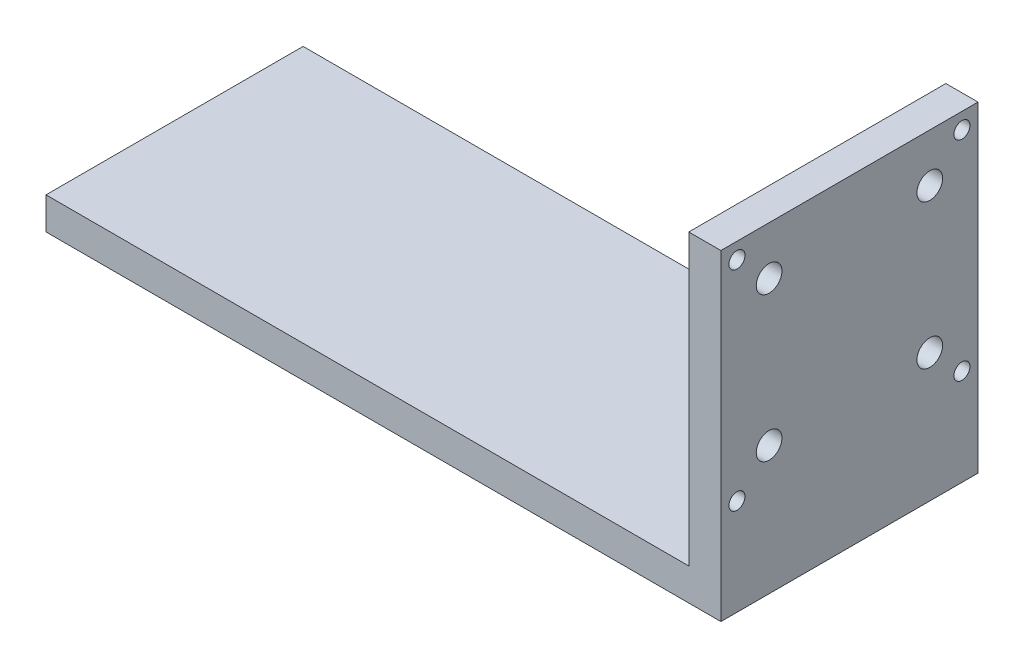
ISO-10303-21;
HEADER;
FILE_DESCRIPTION(('STEP AP214'),'2;1');
FILE_NAME('part.step','',(''),(''),'','','');
FILE_SCHEMA(('AUTOMOTIVE_DESIGN { 1 0 10303 214 1 1 1 1 }'));
ENDSEC;
DATA;
#1=APPLICATION_CONTEXT('core data for automotive mechanical design processes');
#2=APPLICATION_PROTOCOL_DEFINITION('international standard','automotive_design',2000,#1);
#3=PRODUCT_CONTEXT('',#1,'mechanical');
#4=PRODUCT('Part','Part','',(#3));
#5=PRODUCT_RELATED_PRODUCT_CATEGORY('part','',(#4));
#6=PRODUCT_DEFINITION_FORMATION('','',#4);
#7=PRODUCT_DEFINITION_CONTEXT('part definition',#1,'design');
#8=PRODUCT_DEFINITION('design','',#6,#7);
#9=PRODUCT_DEFINITION_SHAPE('','',#8);
#10=(LENGTH_UNIT() NAMED_UNIT(*) SI_UNIT(.MILLI.,.METRE.));
#11=(NAMED_UNIT(*) PLANE_ANGLE_UNIT() SI_UNIT($,.RADIAN.));
#12=(NAMED_UNIT(*) SI_UNIT($,.STERADIAN.) SOLID_ANGLE_UNIT());
#13=UNCERTAINTY_MEASURE_WITH_UNIT(LENGTH_MEASURE(1.E-05),#10,'distance_accuracy_value','');
#14=(GEOMETRIC_REPRESENTATION_CONTEXT(3) GLOBAL_UNCERTAINTY_ASSIGNED_CONTEXT((#13)) GLOBAL_UNIT_ASSIGNED_CONTEXT((#10,
#11,#12)) REPRESENTATION_CONTEXT('',''));
#15=CARTESIAN_POINT('',(0.,0.,0.));
#16=DIRECTION('',(0.,0.,1.));
#17=DIRECTION('',(1.,0.,0.));
#18=AXIS2_PLACEMENT_3D('',#15,#16,#17);
#19=CARTESIAN_POINT('',(-100.,10.,-40.));
#20=DIRECTION('',(0.,0.,1.));
#21=DIRECTION('',(1.,0.,0.));
#22=AXIS2_PLACEMENT_3D('',#19,#20,#21);
#23=PLANE('',#22);
#24=DIRECTION('',(-1.,0.,0.));
#25=VECTOR('',#24,1.);
#26=CARTESIAN_POINT('',(-100.,0.,-40.));
#27=LINE('',#26,#25);
#28=CARTESIAN_POINT('',(110.,0.,-40.));
#29=VERTEX_POINT('',#28);
#30=CARTESIAN_POINT('',(-100.,0.,-40.));
#31=VERTEX_POINT('',#30);
#32=EDGE_CURVE('E71',#29,#31,#27,.T.);
#33=ORIENTED_EDGE('',*,*,#32,.T.);
#34=DIRECTION('',(0.,-1.,0.));
#35=VECTOR('',#34,1.);
#36=CARTESIAN_POINT('',(-100.,10.,-40.));
#37=LINE('',#36,#35);
#38=CARTESIAN_POINT('',(-100.,10.,-40.));
#39=VERTEX_POINT('',#38);
#40=EDGE_CURVE('E11',#39,#31,#37,.T.);
#41=ORIENTED_EDGE('',*,*,#40,.F.);
#42=DIRECTION('',(-1.,0.,0.));
#43=VECTOR('',#42,1.);
#44=CARTESIAN_POINT('',(-100.,10.,-40.));
#45=LINE('',#44,#43);
#46=CARTESIAN_POINT('',(100.,10.,-40.));
#47=VERTEX_POINT('',#46);
#48=EDGE_CURVE('E100',#47,#39,#45,.T.);
#49=ORIENTED_EDGE('',*,*,#48,.F.);
#50=DIRECTION('',(0.,1.,0.));
#51=VECTOR('',#50,1.);
#52=CARTESIAN_POINT('',(100.,0.,-40.));
#53=LINE('',#52,#51);
#54=CARTESIAN_POINT('',(100.,100.,-40.));
#55=VERTEX_POINT('',#54);
#56=EDGE_CURVE('E90',#47,#55,#53,.T.);
#57=ORIENTED_EDGE('',*,*,#56,.T.);
#58=DIRECTION('',(-1.,0.,0.));
#59=VECTOR('',#58,1.);
#60=CARTESIAN_POINT('',(110.,100.,-40.));
#61=LINE('',#60,#59);
#62=CARTESIAN_POINT('',(110.,100.,-40.));
#63=VERTEX_POINT('',#62);
#64=EDGE_CURVE('E111',#63,#55,#61,.T.);
#65=ORIENTED_EDGE('',*,*,#64,.F.);
#66=DIRECTION('',(0.,1.,0.));
#67=VECTOR('',#66,1.);
#68=CARTESIAN_POINT('',(110.,0.,-40.));
#69=LINE('',#68,#67);
#70=EDGE_CURVE('E167',#29,#63,#69,.T.);
#71=ORIENTED_EDGE('',*,*,#70,.F.);
#72=EDGE_LOOP('',(#33,#41,#49,#57,#65,#71));
#73=FACE_BOUND('',#72,.T.);
#74=ADVANCED_FACE('F41',(#73),#23,.F.);
#75=CARTESIAN_POINT('',(-100.,10.,40.));
#76=DIRECTION('',(1.,0.,0.));
#77=DIRECTION('',(0.,0.,-1.));
#78=AXIS2_PLACEMENT_3D('',#75,#76,#77);
#79=PLANE('',#78);
#80=DIRECTION('',(0.,0.,1.));
#81=VECTOR('',#80,1.);
#82=CARTESIAN_POINT('',(-100.,0.,40.));
#83=LINE('',#82,#81);
#84=CARTESIAN_POINT('',(-100.,0.,40.));
#85=VERTEX_POINT('',#84);
#86=EDGE_CURVE('E108',#31,#85,#83,.T.);
#87=ORIENTED_EDGE('',*,*,#86,.T.);
#88=DIRECTION('',(0.,-1.,0.));
#89=VECTOR('',#88,1.);
#90=CARTESIAN_POINT('',(-100.,10.,40.));
#91=LINE('',#90,#89);
#92=CARTESIAN_POINT('',(-100.,10.,40.));
#93=VERTEX_POINT('',#92);
#94=EDGE_CURVE('E50',#93,#85,#91,.T.);
#95=ORIENTED_EDGE('',*,*,#94,.F.);
#96=DIRECTION('',(0.,0.,1.));
#97=VECTOR('',#96,1.);
#98=CARTESIAN_POINT('',(-100.,10.,40.));
#99=LINE('',#98,#97);
#100=EDGE_CURVE('E59',#39,#93,#99,.T.);
#101=ORIENTED_EDGE('',*,*,#100,.F.);
#102=ORIENTED_EDGE('',*,*,#40,.T.);
#103=EDGE_LOOP('',(#87,#95,#101,#102));
#104=FACE_BOUND('',#103,.T.);
#105=ADVANCED_FACE('F207',(#104),#79,.F.);
#106=CARTESIAN_POINT('',(-100.,10.,40.));
#107=DIRECTION('',(0.,0.,-1.));
#108=DIRECTION('',(-1.,0.,0.));
#109=AXIS2_PLACEMENT_3D('',#106,#107,#108);
#110=PLANE('',#109);
#111=DIRECTION('',(1.,0.,0.));
#112=VECTOR('',#111,1.);
#113=CARTESIAN_POINT('',(-100.,0.,40.));
#114=LINE('',#113,#112);
#115=CARTESIAN_POINT('',(110.,0.,40.));
#116=VERTEX_POINT('',#115);
#117=EDGE_CURVE('E105',#85,#116,#114,.T.);
#118=ORIENTED_EDGE('',*,*,#117,.T.);
#119=DIRECTION('',(0.,-1.,0.));
#120=VECTOR('',#119,1.);
#121=CARTESIAN_POINT('',(110.,0.,40.));
#122=LINE('',#121,#120);
#123=CARTESIAN_POINT('',(110.,100.,40.));
#124=VERTEX_POINT('',#123);
#125=EDGE_CURVE('E161',#124,#116,#122,.T.);
#126=ORIENTED_EDGE('',*,*,#125,.F.);
#127=DIRECTION('',(-1.,0.,0.));
#128=VECTOR('',#127,1.);
#129=CARTESIAN_POINT('',(110.,100.,40.));
#130=LINE('',#129,#128);
#131=CARTESIAN_POINT('',(100.,100.,40.));
#132=VERTEX_POINT('',#131);
#133=EDGE_CURVE('E172',#124,#132,#130,.T.);
#134=ORIENTED_EDGE('',*,*,#133,.T.);
#135=DIRECTION('',(0.,-1.,0.));
#136=VECTOR('',#135,1.);
#137=CARTESIAN_POINT('',(100.,0.,40.));
#138=LINE('',#137,#136);
#139=CARTESIAN_POINT('',(100.,10.,40.));
#140=VERTEX_POINT('',#139);
#141=EDGE_CURVE('E98',#132,#140,#138,.T.);
#142=ORIENTED_EDGE('',*,*,#141,.T.);
#143=DIRECTION('',(1.,0.,0.));
#144=VECTOR('',#143,1.);
#145=CARTESIAN_POINT('',(-100.,10.,40.));
#146=LINE('',#145,#144);
#147=EDGE_CURVE('E104',#93,#140,#146,.T.);
#148=ORIENTED_EDGE('',*,*,#147,.F.);
#149=ORIENTED_EDGE('',*,*,#94,.T.);
#150=EDGE_LOOP('',(#118,#126,#134,#142,#148,#149));
#151=FACE_BOUND('',#150,.T.);
#152=ADVANCED_FACE('F189',(#151),#110,.F.);
#153=CARTESIAN_POINT('',(0.,10.,0.));
#154=DIRECTION('',(0.,-1.,0.));
#155=DIRECTION('',(0.,0.,-1.));
#156=AXIS2_PLACEMENT_3D('',#153,#154,#155);
#157=PLANE('',#156);
#158=DIRECTION('',(0.,0.,-1.));
#159=VECTOR('',#158,1.);
#160=CARTESIAN_POINT('',(100.,10.,40.));
#161=LINE('',#160,#159);
#162=EDGE_CURVE('E80',#140,#47,#161,.T.);
#163=ORIENTED_EDGE('',*,*,#162,.T.);
#164=ORIENTED_EDGE('',*,*,#48,.T.);
#165=ORIENTED_EDGE('',*,*,#100,.T.);
#166=ORIENTED_EDGE('',*,*,#147,.T.);
#167=EDGE_LOOP('',(#163,#164,#165,#166));
#168=FACE_BOUND('',#167,.T.);
#169=ADVANCED_FACE('F102',(#168),#157,.F.);
#170=CARTESIAN_POINT('',(0.,0.,0.));
#171=DIRECTION('',(0.,-1.,0.));
#172=DIRECTION('',(0.,0.,-1.));
#173=AXIS2_PLACEMENT_3D('',#170,#171,#172);
#174=PLANE('',#173);
#175=ORIENTED_EDGE('',*,*,#32,.F.);
#176=DIRECTION('',(0.,0.,-1.));
#177=VECTOR('',#176,1.);
#178=CARTESIAN_POINT('',(110.,0.,40.));
#179=LINE('',#178,#177);
#180=EDGE_CURVE('E164',#116,#29,#179,.T.);
#181=ORIENTED_EDGE('',*,*,#180,.F.);
#182=ORIENTED_EDGE('',*,*,#117,.F.);
#183=ORIENTED_EDGE('',*,*,#86,.F.);
#184=EDGE_LOOP('',(#175,#181,#182,#183));
#185=FACE_BOUND('',#184,.T.);
#186=ADVANCED_FACE('F192',(#185),#174,.T.);
#187=CARTESIAN_POINT('',(100.,0.,0.));
#188=DIRECTION('',(-1.,0.,0.));
#189=DIRECTION('',(0.,0.,1.));
#190=AXIS2_PLACEMENT_3D('',#187,#188,#189);
#191=PLANE('',#190);
#192=CARTESIAN_POINT('',(100.,95.,35.));
#193=DIRECTION('',(-1.,0.,0.));
#194=DIRECTION('',(0.,0.,1.));
#195=AXIS2_PLACEMENT_3D('',#192,#193,#194);
#196=CIRCLE('',#195,2.5);
#197=CARTESIAN_POINT('',(100.,95.,37.5));
#198=VERTEX_POINT('',#197);
#199=EDGE_CURVE('E227',#198,#198,#196,.T.);
#200=ORIENTED_EDGE('',*,*,#199,.F.);
#201=EDGE_LOOP('',(#200));
#202=FACE_BOUND('',#201,.T.);
#203=CARTESIAN_POINT('',(100.,30.,-35.));
#204=DIRECTION('',(-1.,0.,0.));
#205=DIRECTION('',(0.,0.,1.));
#206=AXIS2_PLACEMENT_3D('',#203,#204,#205);
#207=CIRCLE('',#206,2.5);
#208=CARTESIAN_POINT('',(100.,30.,-32.5));
#209=VERTEX_POINT('',#208);
#210=EDGE_CURVE('E231',#209,#209,#207,.T.);
#211=ORIENTED_EDGE('',*,*,#210,.F.);
#212=EDGE_LOOP('',(#211));
#213=FACE_BOUND('',#212,.T.);
#214=CARTESIAN_POINT('',(100.,30.,35.));
#215=DIRECTION('',(-1.,0.,0.));
#216=DIRECTION('',(0.,0.,1.));
#217=AXIS2_PLACEMENT_3D('',#214,#215,#216);
#218=CIRCLE('',#217,2.5);
#219=CARTESIAN_POINT('',(100.,30.,37.5));
#220=VERTEX_POINT('',#219);
#221=EDGE_CURVE('E235',#220,#220,#218,.T.);
#222=ORIENTED_EDGE('',*,*,#221,.F.);
#223=EDGE_LOOP('',(#222));
#224=FACE_BOUND('',#223,.T.);
#225=CARTESIAN_POINT('',(100.,95.,-35.));
#226=DIRECTION('',(-1.,0.,0.));
#227=DIRECTION('',(0.,0.,1.));
#228=AXIS2_PLACEMENT_3D('',#225,#226,#227);
#229=CIRCLE('',#228,2.5);
#230=CARTESIAN_POINT('',(100.,95.,-32.5));
#231=VERTEX_POINT('',#230);
#232=EDGE_CURVE('E124',#231,#231,#229,.T.);
#233=ORIENTED_EDGE('',*,*,#232,.F.);
#234=EDGE_LOOP('',(#233));
#235=FACE_BOUND('',#234,.T.);
#236=CARTESIAN_POINT('',(100.,85.,25.));
#237=DIRECTION('',(-1.,0.,0.));
#238=DIRECTION('',(0.,0.,1.));
#239=AXIS2_PLACEMENT_3D('',#236,#237,#238);
#240=CIRCLE('',#239,4.);
#241=CARTESIAN_POINT('',(100.,85.,29.));
#242=VERTEX_POINT('',#241);
#243=EDGE_CURVE('E144',#242,#242,#240,.T.);
#244=ORIENTED_EDGE('',*,*,#243,.F.);
#245=EDGE_LOOP('',(#244));
#246=FACE_BOUND('',#245,.T.);
#247=CARTESIAN_POINT('',(100.,40.,-25.));
#248=DIRECTION('',(-1.,0.,0.));
#249=DIRECTION('',(0.,0.,1.));
#250=AXIS2_PLACEMENT_3D('',#247,#248,#249);
#251=CIRCLE('',#250,4.);
#252=CARTESIAN_POINT('',(100.,40.,-21.));
#253=VERTEX_POINT('',#252);
#254=EDGE_CURVE('E151',#253,#253,#251,.T.);
#255=ORIENTED_EDGE('',*,*,#254,.F.);
#256=EDGE_LOOP('',(#255));
#257=FACE_BOUND('',#256,.T.);
#258=CARTESIAN_POINT('',(100.,40.,25.));
#259=DIRECTION('',(-1.,0.,0.));
#260=DIRECTION('',(0.,0.,1.));
#261=AXIS2_PLACEMENT_3D('',#258,#259,#260);
#262=CIRCLE('',#261,4.);
#263=CARTESIAN_POINT('',(100.,40.,29.));
#264=VERTEX_POINT('',#263);
#265=EDGE_CURVE('E135',#264,#264,#262,.T.);
#266=ORIENTED_EDGE('',*,*,#265,.F.);
#267=EDGE_LOOP('',(#266));
#268=FACE_BOUND('',#267,.T.);
#269=CARTESIAN_POINT('',(100.,85.,-25.));
#270=DIRECTION('',(-1.,0.,0.));
#271=DIRECTION('',(0.,0.,1.));
#272=AXIS2_PLACEMENT_3D('',#269,#270,#271);
#273=CIRCLE('',#272,4.);
#274=CARTESIAN_POINT('',(100.,85.,-21.));
#275=VERTEX_POINT('',#274);
#276=EDGE_CURVE('E147',#275,#275,#273,.T.);
#277=ORIENTED_EDGE('',*,*,#276,.F.);
#278=EDGE_LOOP('',(#277));
#279=FACE_BOUND('',#278,.T.);
#280=ORIENTED_EDGE('',*,*,#162,.F.);
#281=ORIENTED_EDGE('',*,*,#141,.F.);
#282=DIRECTION('',(0.,0.,1.));
#283=VECTOR('',#282,1.);
#284=CARTESIAN_POINT('',(100.,100.,40.));
#285=LINE('',#284,#283);
#286=EDGE_CURVE('E95',#55,#132,#285,.T.);
#287=ORIENTED_EDGE('',*,*,#286,.F.);
#288=ORIENTED_EDGE('',*,*,#56,.F.);
#289=EDGE_LOOP('',(#280,#281,#287,#288));
#290=FACE_BOUND('',#289,.T.);
#291=ADVANCED_FACE('F92',(#202,#213,#224,#235,#246,#257,#268,#279,#290),#191,.T.);
#292=CARTESIAN_POINT('',(110.,100.,40.));
#293=DIRECTION('',(0.,-1.,0.));
#294=DIRECTION('',(0.,0.,-1.));
#295=AXIS2_PLACEMENT_3D('',#292,#293,#294);
#296=PLANE('',#295);
#297=ORIENTED_EDGE('',*,*,#286,.T.);
#298=ORIENTED_EDGE('',*,*,#133,.F.);
#299=DIRECTION('',(0.,0.,1.));
#300=VECTOR('',#299,1.);
#301=CARTESIAN_POINT('',(110.,100.,40.));
#302=LINE('',#301,#300);
#303=EDGE_CURVE('E170',#63,#124,#302,.T.);
#304=ORIENTED_EDGE('',*,*,#303,.F.);
#305=ORIENTED_EDGE('',*,*,#64,.T.);
#306=EDGE_LOOP('',(#297,#298,#304,#305));
#307=FACE_BOUND('',#306,.T.);
#308=ADVANCED_FACE('F180',(#307),#296,.F.);
#309=CARTESIAN_POINT('',(110.,0.,0.));
#310=DIRECTION('',(-1.,0.,0.));
#311=DIRECTION('',(0.,0.,1.));
#312=AXIS2_PLACEMENT_3D('',#309,#310,#311);
#313=PLANE('',#312);
#314=CARTESIAN_POINT('',(110.,95.,35.));
#315=DIRECTION('',(-1.,0.,0.));
#316=DIRECTION('',(0.,0.,1.));
#317=AXIS2_PLACEMENT_3D('',#314,#315,#316);
#318=CIRCLE('',#317,2.5);
#319=CARTESIAN_POINT('',(110.,95.,37.5));
#320=VERTEX_POINT('',#319);
#321=EDGE_CURVE('E44',#320,#320,#318,.T.);
#322=ORIENTED_EDGE('',*,*,#321,.T.);
#323=EDGE_LOOP('',(#322));
#324=FACE_BOUND('',#323,.T.);
#325=CARTESIAN_POINT('',(110.,30.,-35.));
#326=DIRECTION('',(-1.,0.,0.));
#327=DIRECTION('',(0.,0.,1.));
#328=AXIS2_PLACEMENT_3D('',#325,#326,#327);
#329=CIRCLE('',#328,2.5);
#330=CARTESIAN_POINT('',(110.,30.,-32.5));
#331=VERTEX_POINT('',#330);
#332=EDGE_CURVE('E126',#331,#331,#329,.T.);
#333=ORIENTED_EDGE('',*,*,#332,.T.);
#334=EDGE_LOOP('',(#333));
#335=FACE_BOUND('',#334,.T.);
#336=CARTESIAN_POINT('',(110.,30.,35.));
#337=DIRECTION('',(-1.,0.,0.));
#338=DIRECTION('',(0.,0.,1.));
#339=AXIS2_PLACEMENT_3D('',#336,#337,#338);
#340=CIRCLE('',#339,2.5);
#341=CARTESIAN_POINT('',(110.,30.,37.5));
#342=VERTEX_POINT('',#341);
#343=EDGE_CURVE('E123',#342,#342,#340,.T.);
#344=ORIENTED_EDGE('',*,*,#343,.T.);
#345=EDGE_LOOP('',(#344));
#346=FACE_BOUND('',#345,.T.);
#347=CARTESIAN_POINT('',(110.,95.,-35.));
#348=DIRECTION('',(-1.,0.,0.));
#349=DIRECTION('',(0.,0.,1.));
#350=AXIS2_PLACEMENT_3D('',#347,#348,#349);
#351=CIRCLE('',#350,2.5);
#352=CARTESIAN_POINT('',(110.,95.,-32.5));
#353=VERTEX_POINT('',#352);
#354=EDGE_CURVE('E120',#353,#353,#351,.T.);
#355=ORIENTED_EDGE('',*,*,#354,.T.);
#356=EDGE_LOOP('',(#355));
#357=FACE_BOUND('',#356,.T.);
#358=CARTESIAN_POINT('',(110.,85.,25.));
#359=DIRECTION('',(-1.,0.,0.));
#360=DIRECTION('',(0.,0.,1.));
#361=AXIS2_PLACEMENT_3D('',#358,#359,#360);
#362=CIRCLE('',#361,4.);
#363=CARTESIAN_POINT('',(110.,85.,29.));
#364=VERTEX_POINT('',#363);
#365=EDGE_CURVE('E148',#364,#364,#362,.T.);
#366=ORIENTED_EDGE('',*,*,#365,.T.);
#367=EDGE_LOOP('',(#366));
#368=FACE_BOUND('',#367,.T.);
#369=CARTESIAN_POINT('',(110.,40.,-25.));
#370=DIRECTION('',(-1.,0.,0.));
#371=DIRECTION('',(0.,0.,1.));
#372=AXIS2_PLACEMENT_3D('',#369,#370,#371);
#373=CIRCLE('',#372,4.);
#374=CARTESIAN_POINT('',(110.,40.,-21.));
#375=VERTEX_POINT('',#374);
#376=EDGE_CURVE('E140',#375,#375,#373,.T.);
#377=ORIENTED_EDGE('',*,*,#376,.T.);
#378=EDGE_LOOP('',(#377));
#379=FACE_BOUND('',#378,.T.);
#380=CARTESIAN_POINT('',(110.,40.,25.));
#381=DIRECTION('',(-1.,0.,0.));
#382=DIRECTION('',(0.,0.,1.));
#383=AXIS2_PLACEMENT_3D('',#380,#381,#382);
#384=CIRCLE('',#383,4.);
#385=CARTESIAN_POINT('',(110.,40.,29.));
#386=VERTEX_POINT('',#385);
#387=EDGE_CURVE('E131',#386,#386,#384,.T.);
#388=ORIENTED_EDGE('',*,*,#387,.T.);
#389=EDGE_LOOP('',(#388));
#390=FACE_BOUND('',#389,.T.);
#391=CARTESIAN_POINT('',(110.,85.,-25.));
#392=DIRECTION('',(-1.,0.,0.));
#393=DIRECTION('',(0.,0.,1.));
#394=AXIS2_PLACEMENT_3D('',#391,#392,#393);
#395=CIRCLE('',#394,4.);
#396=CARTESIAN_POINT('',(110.,85.,-21.));
#397=VERTEX_POINT('',#396);
#398=EDGE_CURVE('E156',#397,#397,#395,.T.);
#399=ORIENTED_EDGE('',*,*,#398,.T.);
#400=EDGE_LOOP('',(#399));
#401=FACE_BOUND('',#400,.T.);
#402=ORIENTED_EDGE('',*,*,#125,.T.);
#403=ORIENTED_EDGE('',*,*,#180,.T.);
#404=ORIENTED_EDGE('',*,*,#70,.T.);
#405=ORIENTED_EDGE('',*,*,#303,.T.);
#406=EDGE_LOOP('',(#402,#403,#404,#405));
#407=FACE_BOUND('',#406,.T.);
#408=ADVANCED_FACE('F193',(#324,#335,#346,#357,#368,#379,#390,#401,#407),#313,.F.);
#409=CARTESIAN_POINT('',(110.,85.,-25.));
#410=DIRECTION('',(-1.,0.,0.));
#411=DIRECTION('',(0.,0.,1.));
#412=AXIS2_PLACEMENT_3D('',#409,#410,#411);
#413=CYLINDRICAL_SURFACE('',#412,4.);
#414=ORIENTED_EDGE('',*,*,#398,.F.);
#415=EDGE_LOOP('',(#414));
#416=FACE_BOUND('',#415,.T.);
#417=ORIENTED_EDGE('',*,*,#276,.T.);
#418=EDGE_LOOP('',(#417));
#419=FACE_BOUND('',#418,.T.);
#420=ADVANCED_FACE('F195',(#416,#419),#413,.F.);
#421=CARTESIAN_POINT('',(110.,40.,25.));
#422=DIRECTION('',(-1.,0.,0.));
#423=DIRECTION('',(0.,0.,1.));
#424=AXIS2_PLACEMENT_3D('',#421,#422,#423);
#425=CYLINDRICAL_SURFACE('',#424,4.);
#426=ORIENTED_EDGE('',*,*,#387,.F.);
#427=EDGE_LOOP('',(#426));
#428=FACE_BOUND('',#427,.T.);
#429=ORIENTED_EDGE('',*,*,#265,.T.);
#430=EDGE_LOOP('',(#429));
#431=FACE_BOUND('',#430,.T.);
#432=ADVANCED_FACE('F201',(#428,#431),#425,.F.);
#433=CARTESIAN_POINT('',(110.,40.,-25.));
#434=DIRECTION('',(-1.,0.,0.));
#435=DIRECTION('',(0.,0.,1.));
#436=AXIS2_PLACEMENT_3D('',#433,#434,#435);
#437=CYLINDRICAL_SURFACE('',#436,4.);
#438=ORIENTED_EDGE('',*,*,#376,.F.);
#439=EDGE_LOOP('',(#438));
#440=FACE_BOUND('',#439,.T.);
#441=ORIENTED_EDGE('',*,*,#254,.T.);
#442=EDGE_LOOP('',(#441));
#443=FACE_BOUND('',#442,.T.);
#444=ADVANCED_FACE('F249',(#440,#443),#437,.F.);
#445=CARTESIAN_POINT('',(110.,85.,25.));
#446=DIRECTION('',(-1.,0.,0.));
#447=DIRECTION('',(0.,0.,1.));
#448=AXIS2_PLACEMENT_3D('',#445,#446,#447);
#449=CYLINDRICAL_SURFACE('',#448,4.);
#450=ORIENTED_EDGE('',*,*,#365,.F.);
#451=EDGE_LOOP('',(#450));
#452=FACE_BOUND('',#451,.T.);
#453=ORIENTED_EDGE('',*,*,#243,.T.);
#454=EDGE_LOOP('',(#453));
#455=FACE_BOUND('',#454,.T.);
#456=ADVANCED_FACE('F255',(#452,#455),#449,.F.);
#457=CARTESIAN_POINT('',(200.,95.,-35.));
#458=DIRECTION('',(-1.,0.,0.));
#459=DIRECTION('',(0.,0.,1.));
#460=AXIS2_PLACEMENT_3D('',#457,#458,#459);
#461=CYLINDRICAL_SURFACE('',#460,2.5);
#462=ORIENTED_EDGE('',*,*,#232,.T.);
#463=EDGE_LOOP('',(#462));
#464=FACE_BOUND('',#463,.T.);
#465=ORIENTED_EDGE('',*,*,#354,.F.);
#466=EDGE_LOOP('',(#465));
#467=FACE_BOUND('',#466,.T.);
#468=ADVANCED_FACE('F260',(#464,#467),#461,.F.);
#469=CARTESIAN_POINT('',(200.,30.,35.));
#470=DIRECTION('',(-1.,0.,0.));
#471=DIRECTION('',(0.,0.,1.));
#472=AXIS2_PLACEMENT_3D('',#469,#470,#471);
#473=CYLINDRICAL_SURFACE('',#472,2.5);
#474=ORIENTED_EDGE('',*,*,#221,.T.);
#475=EDGE_LOOP('',(#474));
#476=FACE_BOUND('',#475,.T.);
#477=ORIENTED_EDGE('',*,*,#343,.F.);
#478=EDGE_LOOP('',(#477));
#479=FACE_BOUND('',#478,.T.);
#480=ADVANCED_FACE('F267',(#476,#479),#473,.F.);
#481=CARTESIAN_POINT('',(200.,30.,-35.));
#482=DIRECTION('',(-1.,0.,0.));
#483=DIRECTION('',(0.,0.,1.));
#484=AXIS2_PLACEMENT_3D('',#481,#482,#483);
#485=CYLINDRICAL_SURFACE('',#484,2.5);
#486=ORIENTED_EDGE('',*,*,#210,.T.);
#487=EDGE_LOOP('',(#486));
#488=FACE_BOUND('',#487,.T.);
#489=ORIENTED_EDGE('',*,*,#332,.F.);
#490=EDGE_LOOP('',(#489));
#491=FACE_BOUND('',#490,.T.);
#492=ADVANCED_FACE('F280',(#488,#491),#485,.F.);
#493=CARTESIAN_POINT('',(200.,95.,35.));
#494=DIRECTION('',(-1.,0.,0.));
#495=DIRECTION('',(0.,0.,1.));
#496=AXIS2_PLACEMENT_3D('',#493,#494,#495);
#497=CYLINDRICAL_SURFACE('',#496,2.5);
#498=ORIENTED_EDGE('',*,*,#199,.T.);
#499=EDGE_LOOP('',(#498));
#500=FACE_BOUND('',#499,.T.);
#501=ORIENTED_EDGE('',*,*,#321,.F.);
#502=EDGE_LOOP('',(#501));
#503=FACE_BOUND('',#502,.T.);
#504=ADVANCED_FACE('F295',(#500,#503),#497,.F.);
#505=CLOSED_SHELL('',(#74,#105,#152,#169,#186,#291,#308,#408,#420,#432,#444,#456,#468,#480,#492,#504));
#506=MANIFOLD_SOLID_BREP('B2',#505);
#507=ADVANCED_BREP_SHAPE_REPRESENTATION('',(#18,#506),#14);
#508=SHAPE_DEFINITION_REPRESENTATION(#9,#507);
ENDSEC;
END-ISO-10303-21;
